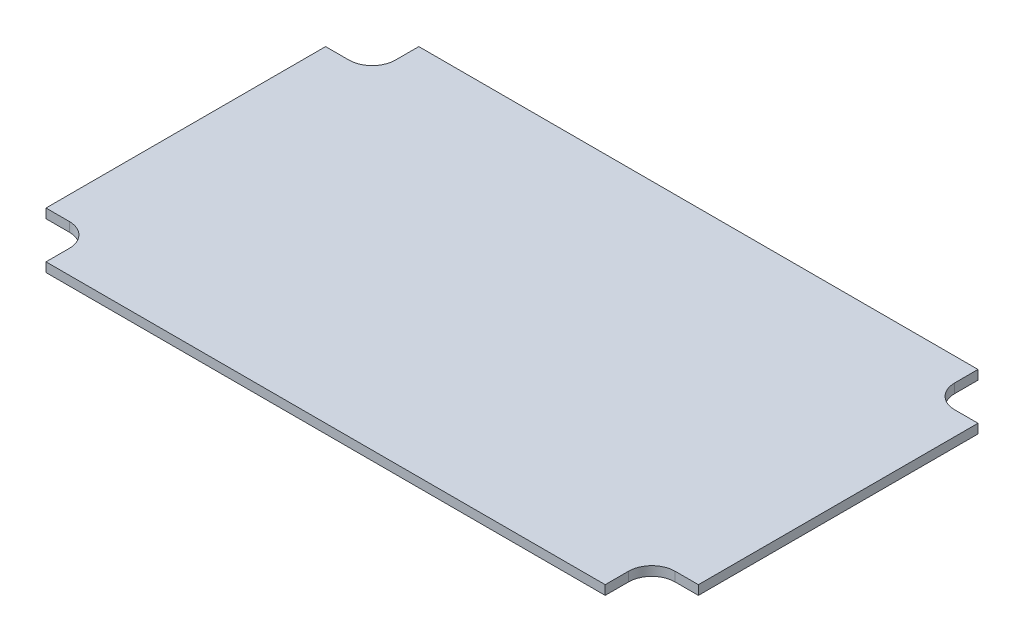
ISO-10303-21;
HEADER;
FILE_DESCRIPTION(('STEP AP214'),'2;1');
FILE_NAME('part.step','',(''),(''),'','','');
FILE_SCHEMA(('AUTOMOTIVE_DESIGN { 1 0 10303 214 1 1 1 1 }'));
ENDSEC;
DATA;
#1=APPLICATION_CONTEXT('core data for automotive mechanical design processes');
#2=APPLICATION_PROTOCOL_DEFINITION('international standard','automotive_design',2000,#1);
#3=PRODUCT_CONTEXT('',#1,'mechanical');
#4=PRODUCT('Part','Part','',(#3));
#5=PRODUCT_RELATED_PRODUCT_CATEGORY('part','',(#4));
#6=PRODUCT_DEFINITION_FORMATION('','',#4);
#7=PRODUCT_DEFINITION_CONTEXT('part definition',#1,'design');
#8=PRODUCT_DEFINITION('design','',#6,#7);
#9=PRODUCT_DEFINITION_SHAPE('','',#8);
#10=(LENGTH_UNIT() NAMED_UNIT(*) SI_UNIT(.MILLI.,.METRE.));
#11=(NAMED_UNIT(*) PLANE_ANGLE_UNIT() SI_UNIT($,.RADIAN.));
#12=(NAMED_UNIT(*) SI_UNIT($,.STERADIAN.) SOLID_ANGLE_UNIT());
#13=UNCERTAINTY_MEASURE_WITH_UNIT(LENGTH_MEASURE(1.E-05),#10,'distance_accuracy_value','');
#14=(GEOMETRIC_REPRESENTATION_CONTEXT(3) GLOBAL_UNCERTAINTY_ASSIGNED_CONTEXT((#13)) GLOBAL_UNIT_ASSIGNED_CONTEXT((#10,
#11,#12)) REPRESENTATION_CONTEXT('',''));
#15=CARTESIAN_POINT('',(0.,0.,0.));
#16=DIRECTION('',(0.,0.,1.));
#17=DIRECTION('',(1.,0.,0.));
#18=AXIS2_PLACEMENT_3D('',#15,#16,#17);
#19=CARTESIAN_POINT('',(0.,2.,30.));
#20=DIRECTION('',(0.,0.,1.));
#21=DIRECTION('',(1.,0.,0.));
#22=AXIS2_PLACEMENT_3D('',#19,#20,#21);
#23=PLANE('',#22);
#24=DIRECTION('',(-1.,0.,0.));
#25=VECTOR('',#24,1.);
#26=CARTESIAN_POINT('',(0.,2.,30.));
#27=LINE('',#26,#25);
#28=CARTESIAN_POINT('',(70.,2.,30.));
#29=VERTEX_POINT('',#28);
#30=CARTESIAN_POINT('',(65.,2.,30.));
#31=VERTEX_POINT('',#30);
#32=EDGE_CURVE('E151',#29,#31,#27,.T.);
#33=ORIENTED_EDGE('',*,*,#32,.T.);
#34=DIRECTION('',(0.,-1.,0.));
#35=VECTOR('',#34,1.);
#36=CARTESIAN_POINT('',(65.,0.,30.));
#37=LINE('',#36,#35);
#38=CARTESIAN_POINT('',(65.,0.,30.));
#39=VERTEX_POINT('',#38);
#40=EDGE_CURVE('E159',#31,#39,#37,.T.);
#41=ORIENTED_EDGE('',*,*,#40,.T.);
#42=DIRECTION('',(-1.,0.,0.));
#43=VECTOR('',#42,1.);
#44=CARTESIAN_POINT('',(0.,0.,30.));
#45=LINE('',#44,#43);
#46=CARTESIAN_POINT('',(70.,0.,30.));
#47=VERTEX_POINT('',#46);
#48=EDGE_CURVE('E154',#47,#39,#45,.T.);
#49=ORIENTED_EDGE('',*,*,#48,.F.);
#50=DIRECTION('',(0.,-1.,0.));
#51=VECTOR('',#50,1.);
#52=CARTESIAN_POINT('',(70.,2.,30.));
#53=LINE('',#52,#51);
#54=EDGE_CURVE('E148',#29,#47,#53,.T.);
#55=ORIENTED_EDGE('',*,*,#54,.F.);
#56=EDGE_LOOP('',(#33,#41,#49,#55));
#57=FACE_BOUND('',#56,.T.);
#58=ADVANCED_FACE('F35',(#57),#23,.T.);
#59=CARTESIAN_POINT('',(70.,2.,0.));
#60=DIRECTION('',(1.,0.,0.));
#61=DIRECTION('',(0.,0.,-1.));
#62=AXIS2_PLACEMENT_3D('',#59,#60,#61);
#63=PLANE('',#62);
#64=DIRECTION('',(0.,0.,1.));
#65=VECTOR('',#64,1.);
#66=CARTESIAN_POINT('',(70.,0.,0.));
#67=LINE('',#66,#65);
#68=CARTESIAN_POINT('',(70.,0.,-30.));
#69=VERTEX_POINT('',#68);
#70=EDGE_CURVE('E201',#69,#47,#67,.T.);
#71=ORIENTED_EDGE('',*,*,#70,.F.);
#72=DIRECTION('',(0.,-1.,0.));
#73=VECTOR('',#72,1.);
#74=CARTESIAN_POINT('',(70.,2.,-30.));
#75=LINE('',#74,#73);
#76=CARTESIAN_POINT('',(70.,2.,-30.));
#77=VERTEX_POINT('',#76);
#78=EDGE_CURVE('E160',#77,#69,#75,.T.);
#79=ORIENTED_EDGE('',*,*,#78,.F.);
#80=DIRECTION('',(0.,0.,1.));
#81=VECTOR('',#80,1.);
#82=CARTESIAN_POINT('',(70.,2.,0.));
#83=LINE('',#82,#81);
#84=EDGE_CURVE('E166',#77,#29,#83,.T.);
#85=ORIENTED_EDGE('',*,*,#84,.T.);
#86=ORIENTED_EDGE('',*,*,#54,.T.);
#87=EDGE_LOOP('',(#71,#79,#85,#86));
#88=FACE_BOUND('',#87,.T.);
#89=ADVANCED_FACE('F172',(#88),#63,.T.);
#90=CARTESIAN_POINT('',(0.,2.,-30.));
#91=DIRECTION('',(0.,0.,1.));
#92=DIRECTION('',(1.,0.,0.));
#93=AXIS2_PLACEMENT_3D('',#90,#91,#92);
#94=PLANE('',#93);
#95=DIRECTION('',(-1.,0.,0.));
#96=VECTOR('',#95,1.);
#97=CARTESIAN_POINT('',(0.,0.,-30.));
#98=LINE('',#97,#96);
#99=CARTESIAN_POINT('',(65.,0.,-30.));
#100=VERTEX_POINT('',#99);
#101=EDGE_CURVE('E203',#69,#100,#98,.T.);
#102=ORIENTED_EDGE('',*,*,#101,.T.);
#103=DIRECTION('',(0.,-1.,0.));
#104=VECTOR('',#103,1.);
#105=CARTESIAN_POINT('',(65.,2.,-30.));
#106=LINE('',#105,#104);
#107=CARTESIAN_POINT('',(65.,2.,-30.));
#108=VERTEX_POINT('',#107);
#109=EDGE_CURVE('E249',#100,#108,#106,.F.);
#110=ORIENTED_EDGE('',*,*,#109,.T.);
#111=DIRECTION('',(-1.,0.,0.));
#112=VECTOR('',#111,1.);
#113=CARTESIAN_POINT('',(0.,2.,-30.));
#114=LINE('',#113,#112);
#115=EDGE_CURVE('E174',#77,#108,#114,.T.);
#116=ORIENTED_EDGE('',*,*,#115,.F.);
#117=ORIENTED_EDGE('',*,*,#78,.T.);
#118=EDGE_LOOP('',(#102,#110,#116,#117));
#119=FACE_BOUND('',#118,.T.);
#120=ADVANCED_FACE('F303',(#119),#94,.F.);
#121=CARTESIAN_POINT('',(60.,2.,0.));
#122=DIRECTION('',(-1.,0.,0.));
#123=DIRECTION('',(0.,0.,1.));
#124=AXIS2_PLACEMENT_3D('',#121,#122,#123);
#125=PLANE('',#124);
#126=DIRECTION('',(0.,0.,-1.));
#127=VECTOR('',#126,1.);
#128=CARTESIAN_POINT('',(60.,2.,0.));
#129=LINE('',#128,#127);
#130=CARTESIAN_POINT('',(60.,2.,-35.));
#131=VERTEX_POINT('',#130);
#132=CARTESIAN_POINT('',(60.,2.,-40.));
#133=VERTEX_POINT('',#132);
#134=EDGE_CURVE('E176',#131,#133,#129,.T.);
#135=ORIENTED_EDGE('',*,*,#134,.F.);
#136=DIRECTION('',(0.,-1.,0.));
#137=VECTOR('',#136,1.);
#138=CARTESIAN_POINT('',(60.,0.,-35.));
#139=LINE('',#138,#137);
#140=CARTESIAN_POINT('',(60.,0.,-35.));
#141=VERTEX_POINT('',#140);
#142=EDGE_CURVE('E246',#131,#141,#139,.T.);
#143=ORIENTED_EDGE('',*,*,#142,.T.);
#144=DIRECTION('',(0.,0.,-1.));
#145=VECTOR('',#144,1.);
#146=CARTESIAN_POINT('',(60.,0.,0.));
#147=LINE('',#146,#145);
#148=CARTESIAN_POINT('',(60.,0.,-40.));
#149=VERTEX_POINT('',#148);
#150=EDGE_CURVE('E206',#141,#149,#147,.T.);
#151=ORIENTED_EDGE('',*,*,#150,.T.);
#152=DIRECTION('',(0.,-1.,0.));
#153=VECTOR('',#152,1.);
#154=CARTESIAN_POINT('',(60.,2.,-40.));
#155=LINE('',#154,#153);
#156=EDGE_CURVE('E239',#133,#149,#155,.T.);
#157=ORIENTED_EDGE('',*,*,#156,.F.);
#158=EDGE_LOOP('',(#135,#143,#151,#157));
#159=FACE_BOUND('',#158,.T.);
#160=ADVANCED_FACE('F296',(#159),#125,.F.);
#161=CARTESIAN_POINT('',(0.,2.,-40.));
#162=DIRECTION('',(0.,0.,-1.));
#163=DIRECTION('',(-1.,0.,0.));
#164=AXIS2_PLACEMENT_3D('',#161,#162,#163);
#165=PLANE('',#164);
#166=DIRECTION('',(1.,0.,0.));
#167=VECTOR('',#166,1.);
#168=CARTESIAN_POINT('',(0.,0.,-40.));
#169=LINE('',#168,#167);
#170=CARTESIAN_POINT('',(-60.,0.,-40.));
#171=VERTEX_POINT('',#170);
#172=EDGE_CURVE('E208',#171,#149,#169,.T.);
#173=ORIENTED_EDGE('',*,*,#172,.F.);
#174=DIRECTION('',(0.,-1.,0.));
#175=VECTOR('',#174,1.);
#176=CARTESIAN_POINT('',(-60.,2.,-40.));
#177=LINE('',#176,#175);
#178=CARTESIAN_POINT('',(-60.,2.,-40.));
#179=VERTEX_POINT('',#178);
#180=EDGE_CURVE('E236',#179,#171,#177,.T.);
#181=ORIENTED_EDGE('',*,*,#180,.F.);
#182=DIRECTION('',(1.,0.,0.));
#183=VECTOR('',#182,1.);
#184=CARTESIAN_POINT('',(0.,2.,-40.));
#185=LINE('',#184,#183);
#186=EDGE_CURVE('E180',#179,#133,#185,.T.);
#187=ORIENTED_EDGE('',*,*,#186,.T.);
#188=ORIENTED_EDGE('',*,*,#156,.T.);
#189=EDGE_LOOP('',(#173,#181,#187,#188));
#190=FACE_BOUND('',#189,.T.);
#191=ADVANCED_FACE('F290',(#190),#165,.T.);
#192=CARTESIAN_POINT('',(-60.,2.,0.));
#193=DIRECTION('',(-1.,0.,0.));
#194=DIRECTION('',(0.,0.,1.));
#195=AXIS2_PLACEMENT_3D('',#192,#193,#194);
#196=PLANE('',#195);
#197=DIRECTION('',(0.,0.,-1.));
#198=VECTOR('',#197,1.);
#199=CARTESIAN_POINT('',(-60.,0.,0.));
#200=LINE('',#199,#198);
#201=CARTESIAN_POINT('',(-60.,0.,-35.));
#202=VERTEX_POINT('',#201);
#203=EDGE_CURVE('E211',#202,#171,#200,.T.);
#204=ORIENTED_EDGE('',*,*,#203,.F.);
#205=DIRECTION('',(0.,-1.,0.));
#206=VECTOR('',#205,1.);
#207=CARTESIAN_POINT('',(-60.,2.,-35.));
#208=LINE('',#207,#206);
#209=CARTESIAN_POINT('',(-60.,2.,-35.));
#210=VERTEX_POINT('',#209);
#211=EDGE_CURVE('E254',#202,#210,#208,.F.);
#212=ORIENTED_EDGE('',*,*,#211,.T.);
#213=DIRECTION('',(0.,0.,-1.));
#214=VECTOR('',#213,1.);
#215=CARTESIAN_POINT('',(-60.,2.,0.));
#216=LINE('',#215,#214);
#217=EDGE_CURVE('E183',#210,#179,#216,.T.);
#218=ORIENTED_EDGE('',*,*,#217,.T.);
#219=ORIENTED_EDGE('',*,*,#180,.T.);
#220=EDGE_LOOP('',(#204,#212,#218,#219));
#221=FACE_BOUND('',#220,.T.);
#222=ADVANCED_FACE('F286',(#221),#196,.T.);
#223=CARTESIAN_POINT('',(0.,2.,-30.));
#224=DIRECTION('',(0.,0.,-1.));
#225=DIRECTION('',(-1.,0.,0.));
#226=AXIS2_PLACEMENT_3D('',#223,#224,#225);
#227=PLANE('',#226);
#228=DIRECTION('',(1.,0.,0.));
#229=VECTOR('',#228,1.);
#230=CARTESIAN_POINT('',(0.,2.,-30.));
#231=LINE('',#230,#229);
#232=CARTESIAN_POINT('',(-70.,2.,-30.));
#233=VERTEX_POINT('',#232);
#234=CARTESIAN_POINT('',(-65.,2.,-30.));
#235=VERTEX_POINT('',#234);
#236=EDGE_CURVE('E185',#233,#235,#231,.T.);
#237=ORIENTED_EDGE('',*,*,#236,.T.);
#238=DIRECTION('',(0.,-1.,0.));
#239=VECTOR('',#238,1.);
#240=CARTESIAN_POINT('',(-65.,0.,-30.));
#241=LINE('',#240,#239);
#242=CARTESIAN_POINT('',(-65.,0.,-30.));
#243=VERTEX_POINT('',#242);
#244=EDGE_CURVE('E251',#235,#243,#241,.T.);
#245=ORIENTED_EDGE('',*,*,#244,.T.);
#246=DIRECTION('',(1.,0.,0.));
#247=VECTOR('',#246,1.);
#248=CARTESIAN_POINT('',(0.,0.,-30.));
#249=LINE('',#248,#247);
#250=CARTESIAN_POINT('',(-70.,0.,-30.));
#251=VERTEX_POINT('',#250);
#252=EDGE_CURVE('E213',#251,#243,#249,.T.);
#253=ORIENTED_EDGE('',*,*,#252,.F.);
#254=DIRECTION('',(0.,-1.,0.));
#255=VECTOR('',#254,1.);
#256=CARTESIAN_POINT('',(-70.,2.,-30.));
#257=LINE('',#256,#255);
#258=EDGE_CURVE('E234',#233,#251,#257,.T.);
#259=ORIENTED_EDGE('',*,*,#258,.F.);
#260=EDGE_LOOP('',(#237,#245,#253,#259));
#261=FACE_BOUND('',#260,.T.);
#262=ADVANCED_FACE('F278',(#261),#227,.T.);
#263=CARTESIAN_POINT('',(-70.,2.,0.));
#264=DIRECTION('',(1.,0.,0.));
#265=DIRECTION('',(0.,0.,-1.));
#266=AXIS2_PLACEMENT_3D('',#263,#264,#265);
#267=PLANE('',#266);
#268=DIRECTION('',(0.,0.,1.));
#269=VECTOR('',#268,1.);
#270=CARTESIAN_POINT('',(-70.,0.,0.));
#271=LINE('',#270,#269);
#272=CARTESIAN_POINT('',(-70.,0.,30.));
#273=VERTEX_POINT('',#272);
#274=EDGE_CURVE('E216',#251,#273,#271,.T.);
#275=ORIENTED_EDGE('',*,*,#274,.T.);
#276=DIRECTION('',(0.,-1.,0.));
#277=VECTOR('',#276,1.);
#278=CARTESIAN_POINT('',(-70.,2.,30.));
#279=LINE('',#278,#277);
#280=CARTESIAN_POINT('',(-70.,2.,30.));
#281=VERTEX_POINT('',#280);
#282=EDGE_CURVE('E231',#281,#273,#279,.T.);
#283=ORIENTED_EDGE('',*,*,#282,.F.);
#284=DIRECTION('',(0.,0.,1.));
#285=VECTOR('',#284,1.);
#286=CARTESIAN_POINT('',(-70.,2.,0.));
#287=LINE('',#286,#285);
#288=EDGE_CURVE('E188',#233,#281,#287,.T.);
#289=ORIENTED_EDGE('',*,*,#288,.F.);
#290=ORIENTED_EDGE('',*,*,#258,.T.);
#291=EDGE_LOOP('',(#275,#283,#289,#290));
#292=FACE_BOUND('',#291,.T.);
#293=ADVANCED_FACE('F337',(#292),#267,.F.);
#294=CARTESIAN_POINT('',(0.,2.,30.));
#295=DIRECTION('',(0.,0.,-1.));
#296=DIRECTION('',(-1.,0.,0.));
#297=AXIS2_PLACEMENT_3D('',#294,#295,#296);
#298=PLANE('',#297);
#299=DIRECTION('',(1.,0.,0.));
#300=VECTOR('',#299,1.);
#301=CARTESIAN_POINT('',(0.,0.,30.));
#302=LINE('',#301,#300);
#303=CARTESIAN_POINT('',(-65.,0.,30.));
#304=VERTEX_POINT('',#303);
#305=EDGE_CURVE('E218',#273,#304,#302,.T.);
#306=ORIENTED_EDGE('',*,*,#305,.T.);
#307=DIRECTION('',(0.,-1.,0.));
#308=VECTOR('',#307,1.);
#309=CARTESIAN_POINT('',(-65.,2.,30.));
#310=LINE('',#309,#308);
#311=CARTESIAN_POINT('',(-65.,2.,30.));
#312=VERTEX_POINT('',#311);
#313=EDGE_CURVE('E50',#304,#312,#310,.F.);
#314=ORIENTED_EDGE('',*,*,#313,.T.);
#315=DIRECTION('',(1.,0.,0.));
#316=VECTOR('',#315,1.);
#317=CARTESIAN_POINT('',(0.,2.,30.));
#318=LINE('',#317,#316);
#319=EDGE_CURVE('E190',#281,#312,#318,.T.);
#320=ORIENTED_EDGE('',*,*,#319,.F.);
#321=ORIENTED_EDGE('',*,*,#282,.T.);
#322=EDGE_LOOP('',(#306,#314,#320,#321));
#323=FACE_BOUND('',#322,.T.);
#324=ADVANCED_FACE('F340',(#323),#298,.F.);
#325=CARTESIAN_POINT('',(-60.,2.,0.));
#326=DIRECTION('',(1.,0.,0.));
#327=DIRECTION('',(0.,0.,-1.));
#328=AXIS2_PLACEMENT_3D('',#325,#326,#327);
#329=PLANE('',#328);
#330=DIRECTION('',(0.,0.,1.));
#331=VECTOR('',#330,1.);
#332=CARTESIAN_POINT('',(-60.,2.,0.));
#333=LINE('',#332,#331);
#334=CARTESIAN_POINT('',(-60.,2.,35.));
#335=VERTEX_POINT('',#334);
#336=CARTESIAN_POINT('',(-60.,2.,40.));
#337=VERTEX_POINT('',#336);
#338=EDGE_CURVE('E192',#335,#337,#333,.T.);
#339=ORIENTED_EDGE('',*,*,#338,.F.);
#340=DIRECTION('',(0.,-1.,0.));
#341=VECTOR('',#340,1.);
#342=CARTESIAN_POINT('',(-60.,0.,35.));
#343=LINE('',#342,#341);
#344=CARTESIAN_POINT('',(-60.,0.,35.));
#345=VERTEX_POINT('',#344);
#346=EDGE_CURVE('E256',#335,#345,#343,.T.);
#347=ORIENTED_EDGE('',*,*,#346,.T.);
#348=DIRECTION('',(0.,0.,1.));
#349=VECTOR('',#348,1.);
#350=CARTESIAN_POINT('',(-60.,0.,0.));
#351=LINE('',#350,#349);
#352=CARTESIAN_POINT('',(-60.,0.,40.));
#353=VERTEX_POINT('',#352);
#354=EDGE_CURVE('E220',#345,#353,#351,.T.);
#355=ORIENTED_EDGE('',*,*,#354,.T.);
#356=DIRECTION('',(0.,-1.,0.));
#357=VECTOR('',#356,1.);
#358=CARTESIAN_POINT('',(-60.,2.,40.));
#359=LINE('',#358,#357);
#360=EDGE_CURVE('E228',#337,#353,#359,.T.);
#361=ORIENTED_EDGE('',*,*,#360,.F.);
#362=EDGE_LOOP('',(#339,#347,#355,#361));
#363=FACE_BOUND('',#362,.T.);
#364=ADVANCED_FACE('F344',(#363),#329,.F.);
#365=CARTESIAN_POINT('',(0.,2.,40.));
#366=DIRECTION('',(0.,0.,-1.));
#367=DIRECTION('',(-1.,0.,0.));
#368=AXIS2_PLACEMENT_3D('',#365,#366,#367);
#369=PLANE('',#368);
#370=DIRECTION('',(1.,0.,0.));
#371=VECTOR('',#370,1.);
#372=CARTESIAN_POINT('',(0.,0.,40.));
#373=LINE('',#372,#371);
#374=CARTESIAN_POINT('',(60.,0.,40.));
#375=VERTEX_POINT('',#374);
#376=EDGE_CURVE('E222',#353,#375,#373,.T.);
#377=ORIENTED_EDGE('',*,*,#376,.T.);
#378=DIRECTION('',(0.,-1.,0.));
#379=VECTOR('',#378,1.);
#380=CARTESIAN_POINT('',(60.,2.,40.));
#381=LINE('',#380,#379);
#382=CARTESIAN_POINT('',(60.,2.,40.));
#383=VERTEX_POINT('',#382);
#384=EDGE_CURVE('E199',#383,#375,#381,.T.);
#385=ORIENTED_EDGE('',*,*,#384,.F.);
#386=DIRECTION('',(1.,0.,0.));
#387=VECTOR('',#386,1.);
#388=CARTESIAN_POINT('',(0.,2.,40.));
#389=LINE('',#388,#387);
#390=EDGE_CURVE('E194',#337,#383,#389,.T.);
#391=ORIENTED_EDGE('',*,*,#390,.F.);
#392=ORIENTED_EDGE('',*,*,#360,.T.);
#393=EDGE_LOOP('',(#377,#385,#391,#392));
#394=FACE_BOUND('',#393,.T.);
#395=ADVANCED_FACE('F347',(#394),#369,.F.);
#396=CARTESIAN_POINT('',(60.,2.,0.));
#397=DIRECTION('',(1.,0.,0.));
#398=DIRECTION('',(0.,0.,-1.));
#399=AXIS2_PLACEMENT_3D('',#396,#397,#398);
#400=PLANE('',#399);
#401=DIRECTION('',(0.,0.,1.));
#402=VECTOR('',#401,1.);
#403=CARTESIAN_POINT('',(60.,0.,0.));
#404=LINE('',#403,#402);
#405=CARTESIAN_POINT('',(60.,0.,35.));
#406=VERTEX_POINT('',#405);
#407=EDGE_CURVE('E170',#406,#375,#404,.T.);
#408=ORIENTED_EDGE('',*,*,#407,.F.);
#409=DIRECTION('',(0.,-1.,0.));
#410=VECTOR('',#409,1.);
#411=CARTESIAN_POINT('',(60.,2.,35.));
#412=LINE('',#411,#410);
#413=CARTESIAN_POINT('',(60.,2.,35.));
#414=VERTEX_POINT('',#413);
#415=EDGE_CURVE('E244',#406,#414,#412,.F.);
#416=ORIENTED_EDGE('',*,*,#415,.T.);
#417=DIRECTION('',(0.,0.,1.));
#418=VECTOR('',#417,1.);
#419=CARTESIAN_POINT('',(60.,2.,0.));
#420=LINE('',#419,#418);
#421=EDGE_CURVE('E197',#414,#383,#420,.T.);
#422=ORIENTED_EDGE('',*,*,#421,.T.);
#423=ORIENTED_EDGE('',*,*,#384,.T.);
#424=EDGE_LOOP('',(#408,#416,#422,#423));
#425=FACE_BOUND('',#424,.T.);
#426=ADVANCED_FACE('F309',(#425),#400,.T.);
#427=CARTESIAN_POINT('',(0.,2.,0.));
#428=DIRECTION('',(0.,1.,0.));
#429=DIRECTION('',(0.,0.,1.));
#430=AXIS2_PLACEMENT_3D('',#427,#428,#429);
#431=PLANE('',#430);
#432=ORIENTED_EDGE('',*,*,#32,.F.);
#433=ORIENTED_EDGE('',*,*,#84,.F.);
#434=ORIENTED_EDGE('',*,*,#115,.T.);
#435=CARTESIAN_POINT('',(65.,2.,-35.));
#436=DIRECTION('',(0.,1.,0.));
#437=DIRECTION('',(0.,0.,1.));
#438=AXIS2_PLACEMENT_3D('',#435,#436,#437);
#439=CIRCLE('',#438,5.);
#440=EDGE_CURVE('E265',#108,#131,#439,.F.);
#441=ORIENTED_EDGE('',*,*,#440,.T.);
#442=ORIENTED_EDGE('',*,*,#134,.T.);
#443=ORIENTED_EDGE('',*,*,#186,.F.);
#444=ORIENTED_EDGE('',*,*,#217,.F.);
#445=CARTESIAN_POINT('',(-65.,2.,-35.));
#446=DIRECTION('',(0.,1.,0.));
#447=DIRECTION('',(0.,0.,1.));
#448=AXIS2_PLACEMENT_3D('',#445,#446,#447);
#449=CIRCLE('',#448,5.);
#450=EDGE_CURVE('E269',#210,#235,#449,.F.);
#451=ORIENTED_EDGE('',*,*,#450,.T.);
#452=ORIENTED_EDGE('',*,*,#236,.F.);
#453=ORIENTED_EDGE('',*,*,#288,.T.);
#454=ORIENTED_EDGE('',*,*,#319,.T.);
#455=CARTESIAN_POINT('',(-65.,2.,35.));
#456=DIRECTION('',(0.,1.,0.));
#457=DIRECTION('',(0.,0.,1.));
#458=AXIS2_PLACEMENT_3D('',#455,#456,#457);
#459=CIRCLE('',#458,5.);
#460=EDGE_CURVE('E11',#312,#335,#459,.F.);
#461=ORIENTED_EDGE('',*,*,#460,.T.);
#462=ORIENTED_EDGE('',*,*,#338,.T.);
#463=ORIENTED_EDGE('',*,*,#390,.T.);
#464=ORIENTED_EDGE('',*,*,#421,.F.);
#465=CARTESIAN_POINT('',(65.,2.,35.));
#466=DIRECTION('',(0.,1.,0.));
#467=DIRECTION('',(0.,0.,1.));
#468=AXIS2_PLACEMENT_3D('',#465,#466,#467);
#469=CIRCLE('',#468,5.);
#470=EDGE_CURVE('E169',#414,#31,#469,.F.);
#471=ORIENTED_EDGE('',*,*,#470,.T.);
#472=EDGE_LOOP('',(#432,#433,#434,#441,#442,#443,#444,#451,#452,#453,#454,#461,#462,#463,#464,#471));
#473=FACE_BOUND('',#472,.T.);
#474=ADVANCED_FACE('F164',(#473),#431,.T.);
#475=CARTESIAN_POINT('',(0.,0.,0.));
#476=DIRECTION('',(0.,1.,0.));
#477=DIRECTION('',(0.,0.,1.));
#478=AXIS2_PLACEMENT_3D('',#475,#476,#477);
#479=PLANE('',#478);
#480=ORIENTED_EDGE('',*,*,#48,.T.);
#481=CARTESIAN_POINT('',(65.,0.,35.));
#482=DIRECTION('',(0.,1.,0.));
#483=DIRECTION('',(0.,0.,1.));
#484=AXIS2_PLACEMENT_3D('',#481,#482,#483);
#485=CIRCLE('',#484,5.);
#486=EDGE_CURVE('E260',#39,#406,#485,.T.);
#487=ORIENTED_EDGE('',*,*,#486,.T.);
#488=ORIENTED_EDGE('',*,*,#407,.T.);
#489=ORIENTED_EDGE('',*,*,#376,.F.);
#490=ORIENTED_EDGE('',*,*,#354,.F.);
#491=CARTESIAN_POINT('',(-65.,0.,35.));
#492=DIRECTION('',(0.,1.,0.));
#493=DIRECTION('',(0.,0.,1.));
#494=AXIS2_PLACEMENT_3D('',#491,#492,#493);
#495=CIRCLE('',#494,5.);
#496=EDGE_CURVE('E43',#345,#304,#495,.T.);
#497=ORIENTED_EDGE('',*,*,#496,.T.);
#498=ORIENTED_EDGE('',*,*,#305,.F.);
#499=ORIENTED_EDGE('',*,*,#274,.F.);
#500=ORIENTED_EDGE('',*,*,#252,.T.);
#501=CARTESIAN_POINT('',(-65.,0.,-35.));
#502=DIRECTION('',(0.,1.,0.));
#503=DIRECTION('',(0.,0.,1.));
#504=AXIS2_PLACEMENT_3D('',#501,#502,#503);
#505=CIRCLE('',#504,5.);
#506=EDGE_CURVE('E267',#243,#202,#505,.T.);
#507=ORIENTED_EDGE('',*,*,#506,.T.);
#508=ORIENTED_EDGE('',*,*,#203,.T.);
#509=ORIENTED_EDGE('',*,*,#172,.T.);
#510=ORIENTED_EDGE('',*,*,#150,.F.);
#511=CARTESIAN_POINT('',(65.,0.,-35.));
#512=DIRECTION('',(0.,1.,0.));
#513=DIRECTION('',(0.,0.,1.));
#514=AXIS2_PLACEMENT_3D('',#511,#512,#513);
#515=CIRCLE('',#514,5.);
#516=EDGE_CURVE('E263',#141,#100,#515,.T.);
#517=ORIENTED_EDGE('',*,*,#516,.T.);
#518=ORIENTED_EDGE('',*,*,#101,.F.);
#519=ORIENTED_EDGE('',*,*,#70,.T.);
#520=EDGE_LOOP('',(#480,#487,#488,#489,#490,#497,#498,#499,#500,#507,#508,#509,#510,#517,#518,#519));
#521=FACE_BOUND('',#520,.T.);
#522=ADVANCED_FACE('F283',(#521),#479,.F.);
#523=CARTESIAN_POINT('',(65.,2.,35.));
#524=DIRECTION('',(0.,1.,0.));
#525=DIRECTION('',(0.,0.,1.));
#526=AXIS2_PLACEMENT_3D('',#523,#524,#525);
#527=CYLINDRICAL_SURFACE('',#526,5.);
#528=ORIENTED_EDGE('',*,*,#470,.F.);
#529=ORIENTED_EDGE('',*,*,#415,.F.);
#530=ORIENTED_EDGE('',*,*,#486,.F.);
#531=ORIENTED_EDGE('',*,*,#40,.F.);
#532=EDGE_LOOP('',(#528,#529,#530,#531));
#533=FACE_BOUND('',#532,.T.);
#534=ADVANCED_FACE('F311',(#533),#527,.F.);
#535=CARTESIAN_POINT('',(65.,2.,-35.));
#536=DIRECTION('',(0.,1.,0.));
#537=DIRECTION('',(0.,0.,1.));
#538=AXIS2_PLACEMENT_3D('',#535,#536,#537);
#539=CYLINDRICAL_SURFACE('',#538,5.);
#540=ORIENTED_EDGE('',*,*,#440,.F.);
#541=ORIENTED_EDGE('',*,*,#109,.F.);
#542=ORIENTED_EDGE('',*,*,#516,.F.);
#543=ORIENTED_EDGE('',*,*,#142,.F.);
#544=EDGE_LOOP('',(#540,#541,#542,#543));
#545=FACE_BOUND('',#544,.T.);
#546=ADVANCED_FACE('F300',(#545),#539,.F.);
#547=CARTESIAN_POINT('',(-65.,2.,-35.));
#548=DIRECTION('',(0.,1.,0.));
#549=DIRECTION('',(0.,0.,1.));
#550=AXIS2_PLACEMENT_3D('',#547,#548,#549);
#551=CYLINDRICAL_SURFACE('',#550,5.);
#552=ORIENTED_EDGE('',*,*,#450,.F.);
#553=ORIENTED_EDGE('',*,*,#211,.F.);
#554=ORIENTED_EDGE('',*,*,#506,.F.);
#555=ORIENTED_EDGE('',*,*,#244,.F.);
#556=EDGE_LOOP('',(#552,#553,#554,#555));
#557=FACE_BOUND('',#556,.T.);
#558=ADVANCED_FACE('F281',(#557),#551,.F.);
#559=CARTESIAN_POINT('',(-65.,2.,35.));
#560=DIRECTION('',(0.,1.,0.));
#561=DIRECTION('',(0.,0.,1.));
#562=AXIS2_PLACEMENT_3D('',#559,#560,#561);
#563=CYLINDRICAL_SURFACE('',#562,5.);
#564=ORIENTED_EDGE('',*,*,#460,.F.);
#565=ORIENTED_EDGE('',*,*,#313,.F.);
#566=ORIENTED_EDGE('',*,*,#496,.F.);
#567=ORIENTED_EDGE('',*,*,#346,.F.);
#568=EDGE_LOOP('',(#564,#565,#566,#567));
#569=FACE_BOUND('',#568,.T.);
#570=ADVANCED_FACE('F37',(#569),#563,.F.);
#571=CLOSED_SHELL('',(#58,#89,#120,#160,#191,#222,#262,#293,#324,#364,#395,#426,#474,#522,#534,
#546,#558,#570));
#572=MANIFOLD_SOLID_BREP('B2',#571);
#573=ADVANCED_BREP_SHAPE_REPRESENTATION('',(#18,#572),#14);
#574=SHAPE_DEFINITION_REPRESENTATION(#9,#573);
ENDSEC;
END-ISO-10303-21;
